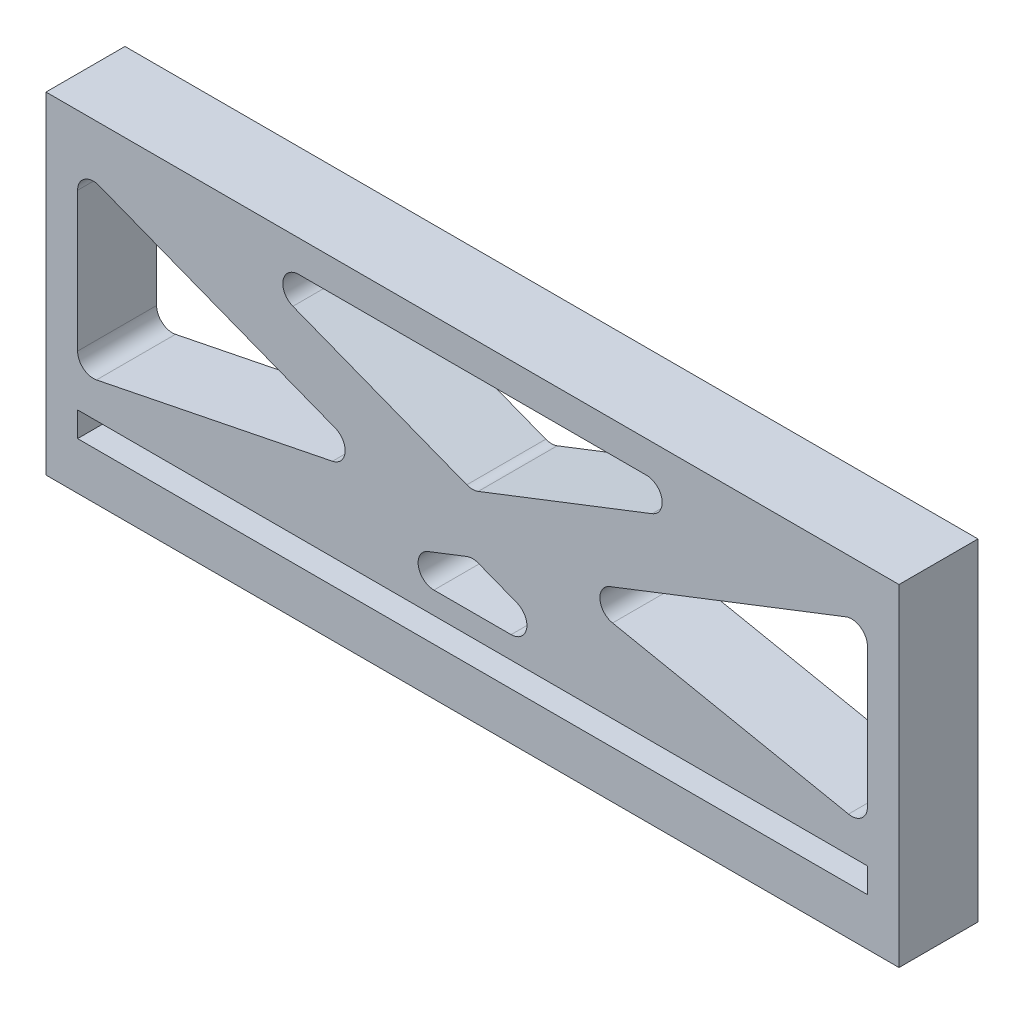
ISO-10303-21;
HEADER;
FILE_DESCRIPTION(('STEP AP214'),'2;1');
FILE_NAME('part.step','',(''),(''),'','','');
FILE_SCHEMA(('AUTOMOTIVE_DESIGN { 1 0 10303 214 1 1 1 1 }'));
ENDSEC;
DATA;
#1=APPLICATION_CONTEXT('core data for automotive mechanical design processes');
#2=APPLICATION_PROTOCOL_DEFINITION('international standard','automotive_design',2000,#1);
#3=PRODUCT_CONTEXT('',#1,'mechanical');
#4=PRODUCT('Part','Part','',(#3));
#5=PRODUCT_RELATED_PRODUCT_CATEGORY('part','',(#4));
#6=PRODUCT_DEFINITION_FORMATION('','',#4);
#7=PRODUCT_DEFINITION_CONTEXT('part definition',#1,'design');
#8=PRODUCT_DEFINITION('design','',#6,#7);
#9=PRODUCT_DEFINITION_SHAPE('','',#8);
#10=(LENGTH_UNIT() NAMED_UNIT(*) SI_UNIT(.MILLI.,.METRE.));
#11=(NAMED_UNIT(*) PLANE_ANGLE_UNIT() SI_UNIT($,.RADIAN.));
#12=(NAMED_UNIT(*) SI_UNIT($,.STERADIAN.) SOLID_ANGLE_UNIT());
#13=UNCERTAINTY_MEASURE_WITH_UNIT(LENGTH_MEASURE(1.E-05),#10,'distance_accuracy_value','');
#14=(GEOMETRIC_REPRESENTATION_CONTEXT(3) GLOBAL_UNCERTAINTY_ASSIGNED_CONTEXT((#13)) GLOBAL_UNIT_ASSIGNED_CONTEXT((#10,
#11,#12)) REPRESENTATION_CONTEXT('',''));
#15=CARTESIAN_POINT('',(0.,0.,0.));
#16=DIRECTION('',(0.,0.,1.));
#17=DIRECTION('',(1.,0.,0.));
#18=AXIS2_PLACEMENT_3D('',#15,#16,#17);
#19=CARTESIAN_POINT('',(0.,0.,6.35));
#20=DIRECTION('',(0.,0.,-1.));
#21=DIRECTION('',(-1.,0.,0.));
#22=AXIS2_PLACEMENT_3D('',#19,#20,#21);
#23=PLANE('',#22);
#24=DIRECTION('',(0.980300913785245,-0.197509793255458,0.));
#25=VECTOR('',#24,1.);
#26=CARTESIAN_POINT('',(31.75,-4.985,6.35));
#27=LINE('',#26,#25);
#28=CARTESIAN_POINT('',(11.2596732728427,-0.856634782027542,6.35));
#29=VERTEX_POINT('',#28);
#30=CARTESIAN_POINT('',(30.2291625625656,-4.67858358885643,6.35));
#31=VERTEX_POINT('',#30);
#32=EDGE_CURVE('E532',#29,#31,#27,.T.);
#33=ORIENTED_EDGE('',*,*,#32,.F.);
#34=CARTESIAN_POINT('',(11.5105107102771,0.388347378479719,6.35));
#35=DIRECTION('',(0.,0.,-1.));
#36=DIRECTION('',(-1.,0.,0.));
#37=AXIS2_PLACEMENT_3D('',#34,#35,#36);
#38=CIRCLE('',#37,1.27);
#39=CARTESIAN_POINT('',(11.0502039586103,1.57199331133717,6.35));
#40=VERTEX_POINT('',#39);
#41=EDGE_CURVE('E445',#29,#40,#38,.T.);
#42=ORIENTED_EDGE('',*,*,#41,.T.);
#43=DIRECTION('',(-0.932004671541298,-0.362446261154944,0.));
#44=VECTOR('',#43,1.);
#45=CARTESIAN_POINT('',(7.00793544374329,0.,6.35));
#46=LINE('',#45,#44);
#47=CARTESIAN_POINT('',(30.0196932483333,8.94901692400708,6.35));
#48=VERTEX_POINT('',#47);
#49=EDGE_CURVE('E541',#48,#40,#46,.T.);
#50=ORIENTED_EDGE('',*,*,#49,.F.);
#51=CARTESIAN_POINT('',(30.48,7.76537099114963,6.35));
#52=DIRECTION('',(0.,0.,-1.));
#53=DIRECTION('',(-1.,0.,0.));
#54=AXIS2_PLACEMENT_3D('',#51,#52,#53);
#55=CIRCLE('',#54,1.27);
#56=CARTESIAN_POINT('',(31.75,7.76537099114963,6.35));
#57=VERTEX_POINT('',#56);
#58=EDGE_CURVE('E433',#48,#57,#55,.T.);
#59=ORIENTED_EDGE('',*,*,#58,.T.);
#60=DIRECTION('',(0.,1.,0.));
#61=VECTOR('',#60,1.);
#62=CARTESIAN_POINT('',(31.75,9.62191399409971,6.35));
#63=LINE('',#62,#61);
#64=CARTESIAN_POINT('',(31.75,-3.43360142834917,6.35));
#65=VERTEX_POINT('',#64);
#66=EDGE_CURVE('E536',#65,#57,#63,.T.);
#67=ORIENTED_EDGE('',*,*,#66,.F.);
#68=CARTESIAN_POINT('',(30.48,-3.43360142834917,6.35));
#69=DIRECTION('',(0.,0.,-1.));
#70=DIRECTION('',(-1.,0.,0.));
#71=AXIS2_PLACEMENT_3D('',#68,#69,#70);
#72=CIRCLE('',#71,1.27);
#73=EDGE_CURVE('E439',#65,#31,#72,.T.);
#74=ORIENTED_EDGE('',*,*,#73,.T.);
#75=EDGE_LOOP('',(#33,#42,#50,#59,#67,#74));
#76=FACE_BOUND('',#75,.T.);
#77=DIRECTION('',(-1.,0.,0.));
#78=VECTOR('',#77,1.);
#79=CARTESIAN_POINT('',(20.7506359848282,10.795,6.35));
#80=LINE('',#79,#78);
#81=CARTESIAN_POINT('',(13.9809539772422,10.795,6.35));
#82=VERTEX_POINT('',#81);
#83=CARTESIAN_POINT('',(-13.9809539772422,10.795,6.35));
#84=VERTEX_POINT('',#83);
#85=EDGE_CURVE('E580',#82,#84,#80,.T.);
#86=ORIENTED_EDGE('',*,*,#85,.F.);
#87=CARTESIAN_POINT('',(13.9809539772422,9.52500000000001,6.35));
#88=DIRECTION('',(0.,0.,-1.));
#89=DIRECTION('',(-1.,0.,0.));
#90=AXIS2_PLACEMENT_3D('',#87,#88,#89);
#91=CIRCLE('',#90,1.27);
#92=CARTESIAN_POINT('',(14.441260728909,8.34135406714256,6.35));
#93=VERTEX_POINT('',#92);
#94=EDGE_CURVE('E451',#82,#93,#91,.T.);
#95=ORIENTED_EDGE('',*,*,#94,.T.);
#96=DIRECTION('',(0.932004671541296,0.362446261154949,0.));
#97=VECTOR('',#96,1.);
#98=CARTESIAN_POINT('',(0.,2.72530822812238,6.35));
#99=LINE('',#98,#97);
#100=CARTESIAN_POINT('',(0.460306751666785,2.90431640932613,6.35));
#101=VERTEX_POINT('',#100);
#102=EDGE_CURVE('E289',#101,#93,#99,.T.);
#103=ORIENTED_EDGE('',*,*,#102,.F.);
#104=CARTESIAN_POINT('',(0.,4.08796234218358,6.35));
#105=DIRECTION('',(0.,0.,-1.));
#106=DIRECTION('',(-1.,0.,0.));
#107=AXIS2_PLACEMENT_3D('',#104,#105,#106);
#108=CIRCLE('',#107,1.27);
#109=CARTESIAN_POINT('',(-0.460306751666785,2.90431640932613,6.35));
#110=VERTEX_POINT('',#109);
#111=EDGE_CURVE('E463',#101,#110,#108,.T.);
#112=ORIENTED_EDGE('',*,*,#111,.T.);
#113=DIRECTION('',(0.932004671541296,-0.362446261154949,0.));
#114=VECTOR('',#113,1.);
#115=CARTESIAN_POINT('',(-20.7506359848282,10.795,6.35));
#116=LINE('',#115,#114);
#117=CARTESIAN_POINT('',(-14.441260728909,8.34135406714256,6.35));
#118=VERTEX_POINT('',#117);
#119=EDGE_CURVE('E584',#118,#110,#116,.T.);
#120=ORIENTED_EDGE('',*,*,#119,.F.);
#121=CARTESIAN_POINT('',(-13.9809539772422,9.52500000000001,6.35));
#122=DIRECTION('',(0.,0.,-1.));
#123=DIRECTION('',(-1.,0.,0.));
#124=AXIS2_PLACEMENT_3D('',#121,#122,#123);
#125=CIRCLE('',#124,1.27);
#126=EDGE_CURVE('E457',#118,#84,#125,.T.);
#127=ORIENTED_EDGE('',*,*,#126,.T.);
#128=EDGE_LOOP('',(#86,#95,#103,#112,#120,#127));
#129=FACE_BOUND('',#128,.T.);
#130=DIRECTION('',(0.,1.,0.));
#131=VECTOR('',#130,1.);
#132=CARTESIAN_POINT('',(34.29,-13.335,6.35));
#133=LINE('',#132,#131);
#134=CARTESIAN_POINT('',(34.29,-13.335,6.35));
#135=VERTEX_POINT('',#134);
#136=CARTESIAN_POINT('',(34.29,13.335,6.35));
#137=VERTEX_POINT('',#136);
#138=EDGE_CURVE('E306',#135,#137,#133,.T.);
#139=ORIENTED_EDGE('',*,*,#138,.T.);
#140=DIRECTION('',(-1.,0.,0.));
#141=VECTOR('',#140,1.);
#142=CARTESIAN_POINT('',(-34.29,13.335,6.35));
#143=LINE('',#142,#141);
#144=CARTESIAN_POINT('',(-34.29,13.335,6.35));
#145=VERTEX_POINT('',#144);
#146=EDGE_CURVE('E310',#137,#145,#143,.T.);
#147=ORIENTED_EDGE('',*,*,#146,.T.);
#148=DIRECTION('',(0.,-1.,0.));
#149=VECTOR('',#148,1.);
#150=CARTESIAN_POINT('',(-34.29,-13.335,6.35));
#151=LINE('',#150,#149);
#152=CARTESIAN_POINT('',(-34.29,-13.335,6.35));
#153=VERTEX_POINT('',#152);
#154=EDGE_CURVE('E314',#145,#153,#151,.T.);
#155=ORIENTED_EDGE('',*,*,#154,.T.);
#156=DIRECTION('',(1.,0.,0.));
#157=VECTOR('',#156,1.);
#158=CARTESIAN_POINT('',(-34.29,-13.335,6.35));
#159=LINE('',#158,#157);
#160=EDGE_CURVE('E317',#153,#135,#159,.T.);
#161=ORIENTED_EDGE('',*,*,#160,.T.);
#162=EDGE_LOOP('',(#139,#147,#155,#161));
#163=FACE_BOUND('',#162,.T.);
#164=DIRECTION('',(0.,1.,0.));
#165=VECTOR('',#164,1.);
#166=CARTESIAN_POINT('',(31.75,-9.525,6.35));
#167=LINE('',#166,#165);
#168=CARTESIAN_POINT('',(31.75,-9.525,6.35));
#169=VERTEX_POINT('',#168);
#170=CARTESIAN_POINT('',(31.75,-7.525,6.35));
#171=VERTEX_POINT('',#170);
#172=EDGE_CURVE('E250',#169,#171,#167,.T.);
#173=ORIENTED_EDGE('',*,*,#172,.F.);
#174=DIRECTION('',(1.,0.,0.));
#175=VECTOR('',#174,1.);
#176=CARTESIAN_POINT('',(-31.75,-9.525,6.35));
#177=LINE('',#176,#175);
#178=CARTESIAN_POINT('',(-31.75,-9.525,6.35));
#179=VERTEX_POINT('',#178);
#180=EDGE_CURVE('E280',#179,#169,#177,.T.);
#181=ORIENTED_EDGE('',*,*,#180,.F.);
#182=DIRECTION('',(0.,-1.,0.));
#183=VECTOR('',#182,1.);
#184=CARTESIAN_POINT('',(-31.75,-9.525,6.35));
#185=LINE('',#184,#183);
#186=CARTESIAN_POINT('',(-31.75,-7.525,6.35));
#187=VERTEX_POINT('',#186);
#188=EDGE_CURVE('E276',#187,#179,#185,.T.);
#189=ORIENTED_EDGE('',*,*,#188,.F.);
#190=DIRECTION('',(-1.,0.,0.));
#191=VECTOR('',#190,1.);
#192=CARTESIAN_POINT('',(-31.75,-7.525,6.35));
#193=LINE('',#192,#191);
#194=EDGE_CURVE('E261',#171,#187,#193,.T.);
#195=ORIENTED_EDGE('',*,*,#194,.F.);
#196=EDGE_LOOP('',(#173,#181,#189,#195));
#197=FACE_BOUND('',#196,.T.);
#198=DIRECTION('',(-0.932004671541296,0.362446261154948,0.));
#199=VECTOR('',#198,1.);
#200=CARTESIAN_POINT('',(-7.0079354437433,0.,6.35));
#201=LINE('',#200,#199);
#202=CARTESIAN_POINT('',(-11.0502039586103,1.57199331133717,6.35));
#203=VERTEX_POINT('',#202);
#204=CARTESIAN_POINT('',(-30.0196932483332,8.94901692400719,6.35));
#205=VERTEX_POINT('',#204);
#206=EDGE_CURVE('E556',#203,#205,#201,.T.);
#207=ORIENTED_EDGE('',*,*,#206,.F.);
#208=CARTESIAN_POINT('',(-11.5105107102771,0.388347378479725,6.35));
#209=DIRECTION('',(0.,0.,-1.));
#210=DIRECTION('',(-1.,0.,0.));
#211=AXIS2_PLACEMENT_3D('',#208,#209,#210);
#212=CIRCLE('',#211,1.27);
#213=CARTESIAN_POINT('',(-11.2596732728427,-0.856634782027537,6.35));
#214=VERTEX_POINT('',#213);
#215=EDGE_CURVE('E469',#203,#214,#212,.T.);
#216=ORIENTED_EDGE('',*,*,#215,.T.);
#217=DIRECTION('',(0.980300913785245,0.197509793255458,0.));
#218=VECTOR('',#217,1.);
#219=CARTESIAN_POINT('',(-31.75,-4.985,6.35));
#220=LINE('',#219,#218);
#221=CARTESIAN_POINT('',(-30.2291625625656,-4.67858358885643,6.35));
#222=VERTEX_POINT('',#221);
#223=EDGE_CURVE('E565',#222,#214,#220,.T.);
#224=ORIENTED_EDGE('',*,*,#223,.F.);
#225=CARTESIAN_POINT('',(-30.48,-3.43360142834917,6.35));
#226=DIRECTION('',(0.,0.,-1.));
#227=DIRECTION('',(-1.,0.,0.));
#228=AXIS2_PLACEMENT_3D('',#225,#226,#227);
#229=CIRCLE('',#228,1.27);
#230=CARTESIAN_POINT('',(-31.75,-3.43360142834917,6.35));
#231=VERTEX_POINT('',#230);
#232=EDGE_CURVE('E481',#222,#231,#229,.T.);
#233=ORIENTED_EDGE('',*,*,#232,.T.);
#234=DIRECTION('',(0.,-1.,0.));
#235=VECTOR('',#234,1.);
#236=CARTESIAN_POINT('',(-31.75,9.62191399409983,6.35));
#237=LINE('',#236,#235);
#238=CARTESIAN_POINT('',(-31.75,7.76537099114975,6.35));
#239=VERTEX_POINT('',#238);
#240=EDGE_CURVE('E560',#239,#231,#237,.T.);
#241=ORIENTED_EDGE('',*,*,#240,.F.);
#242=CARTESIAN_POINT('',(-30.48,7.76537099114975,6.35));
#243=DIRECTION('',(0.,0.,-1.));
#244=DIRECTION('',(-1.,0.,0.));
#245=AXIS2_PLACEMENT_3D('',#242,#243,#244);
#246=CIRCLE('',#245,1.27);
#247=EDGE_CURVE('E475',#239,#205,#246,.T.);
#248=ORIENTED_EDGE('',*,*,#247,.T.);
#249=EDGE_LOOP('',(#207,#216,#224,#233,#241,#248));
#250=FACE_BOUND('',#249,.T.);
#251=DIRECTION('',(-0.932004671541296,0.362446261154949,0.));
#252=VECTOR('',#251,1.);
#253=CARTESIAN_POINT('',(9.8724451893797,-5.747,6.35));
#254=LINE('',#253,#252);
#255=CARTESIAN_POINT('',(3.56306993346055,-3.29335406714255,6.35));
#256=VERTEX_POINT('',#255);
#257=CARTESIAN_POINT('',(0.460306751666783,-2.08672394088942,6.35));
#258=VERTEX_POINT('',#257);
#259=EDGE_CURVE('E511',#256,#258,#254,.T.);
#260=ORIENTED_EDGE('',*,*,#259,.F.);
#261=CARTESIAN_POINT('',(3.10276318179377,-4.477,6.35));
#262=DIRECTION('',(0.,0.,-1.));
#263=DIRECTION('',(-1.,0.,0.));
#264=AXIS2_PLACEMENT_3D('',#261,#262,#263);
#265=CIRCLE('',#264,1.27);
#266=CARTESIAN_POINT('',(3.10276318179377,-5.747,6.35));
#267=VERTEX_POINT('',#266);
#268=EDGE_CURVE('E487',#256,#267,#265,.T.);
#269=ORIENTED_EDGE('',*,*,#268,.T.);
#270=DIRECTION('',(1.,0.,0.));
#271=VECTOR('',#270,1.);
#272=CARTESIAN_POINT('',(-9.8724451893797,-5.747,6.35));
#273=LINE('',#272,#271);
#274=CARTESIAN_POINT('',(-3.10276318179377,-5.747,6.35));
#275=VERTEX_POINT('',#274);
#276=EDGE_CURVE('E517',#275,#267,#273,.T.);
#277=ORIENTED_EDGE('',*,*,#276,.F.);
#278=CARTESIAN_POINT('',(-3.10276318179377,-4.477,6.35));
#279=DIRECTION('',(0.,0.,-1.));
#280=DIRECTION('',(-1.,0.,0.));
#281=AXIS2_PLACEMENT_3D('',#278,#279,#280);
#282=CIRCLE('',#281,1.27);
#283=CARTESIAN_POINT('',(-3.56306993346056,-3.29335406714255,6.35));
#284=VERTEX_POINT('',#283);
#285=EDGE_CURVE('E11',#275,#284,#282,.T.);
#286=ORIENTED_EDGE('',*,*,#285,.T.);
#287=DIRECTION('',(-0.932004671541296,-0.362446261154949,0.));
#288=VECTOR('',#287,1.);
#289=CARTESIAN_POINT('',(0.,-1.90771575968567,6.35));
#290=LINE('',#289,#288);
#291=CARTESIAN_POINT('',(-0.460306751666785,-2.08672394088942,6.35));
#292=VERTEX_POINT('',#291);
#293=EDGE_CURVE('E514',#292,#284,#290,.T.);
#294=ORIENTED_EDGE('',*,*,#293,.F.);
#295=CARTESIAN_POINT('',(0.,-3.27036987374687,6.35));
#296=DIRECTION('',(0.,0.,-1.));
#297=DIRECTION('',(-1.,0.,0.));
#298=AXIS2_PLACEMENT_3D('',#295,#296,#297);
#299=CIRCLE('',#298,1.27);
#300=EDGE_CURVE('E493',#292,#258,#299,.T.);
#301=ORIENTED_EDGE('',*,*,#300,.T.);
#302=EDGE_LOOP('',(#260,#269,#277,#286,#294,#301));
#303=FACE_BOUND('',#302,.T.);
#304=ADVANCED_FACE('F39',(#76,#129,#163,#197,#250,#303),#23,.F.);
#305=CARTESIAN_POINT('',(0.,0.,0.));
#306=DIRECTION('',(0.,0.,-1.));
#307=DIRECTION('',(-1.,0.,0.));
#308=AXIS2_PLACEMENT_3D('',#305,#306,#307);
#309=PLANE('',#308);
#310=DIRECTION('',(0.,1.,0.));
#311=VECTOR('',#310,1.);
#312=CARTESIAN_POINT('',(34.29,-13.335,0.));
#313=LINE('',#312,#311);
#314=CARTESIAN_POINT('',(34.29,-13.335,0.));
#315=VERTEX_POINT('',#314);
#316=CARTESIAN_POINT('',(34.29,13.335,0.));
#317=VERTEX_POINT('',#316);
#318=EDGE_CURVE('E270',#315,#317,#313,.T.);
#319=ORIENTED_EDGE('',*,*,#318,.F.);
#320=DIRECTION('',(1.,0.,0.));
#321=VECTOR('',#320,1.);
#322=CARTESIAN_POINT('',(-34.29,-13.335,0.));
#323=LINE('',#322,#321);
#324=CARTESIAN_POINT('',(-34.29,-13.335,0.));
#325=VERTEX_POINT('',#324);
#326=EDGE_CURVE('E311',#325,#315,#323,.T.);
#327=ORIENTED_EDGE('',*,*,#326,.F.);
#328=DIRECTION('',(0.,-1.,0.));
#329=VECTOR('',#328,1.);
#330=CARTESIAN_POINT('',(-34.29,-13.335,0.));
#331=LINE('',#330,#329);
#332=CARTESIAN_POINT('',(-34.29,13.335,0.));
#333=VERTEX_POINT('',#332);
#334=EDGE_CURVE('E327',#333,#325,#331,.T.);
#335=ORIENTED_EDGE('',*,*,#334,.F.);
#336=DIRECTION('',(-1.,0.,0.));
#337=VECTOR('',#336,1.);
#338=CARTESIAN_POINT('',(-34.29,13.335,0.));
#339=LINE('',#338,#337);
#340=EDGE_CURVE('E324',#317,#333,#339,.T.);
#341=ORIENTED_EDGE('',*,*,#340,.F.);
#342=EDGE_LOOP('',(#319,#327,#335,#341));
#343=FACE_BOUND('',#342,.T.);
#344=DIRECTION('',(1.,0.,0.));
#345=VECTOR('',#344,1.);
#346=CARTESIAN_POINT('',(-31.75,-9.525,0.));
#347=LINE('',#346,#345);
#348=CARTESIAN_POINT('',(-31.75,-9.525,0.));
#349=VERTEX_POINT('',#348);
#350=CARTESIAN_POINT('',(31.75,-9.525,0.));
#351=VERTEX_POINT('',#350);
#352=EDGE_CURVE('E262',#349,#351,#347,.T.);
#353=ORIENTED_EDGE('',*,*,#352,.T.);
#354=DIRECTION('',(0.,1.,0.));
#355=VECTOR('',#354,1.);
#356=CARTESIAN_POINT('',(31.75,-9.525,0.));
#357=LINE('',#356,#355);
#358=CARTESIAN_POINT('',(31.75,-7.525,0.));
#359=VERTEX_POINT('',#358);
#360=EDGE_CURVE('E286',#351,#359,#357,.T.);
#361=ORIENTED_EDGE('',*,*,#360,.T.);
#362=DIRECTION('',(-1.,0.,0.));
#363=VECTOR('',#362,1.);
#364=CARTESIAN_POINT('',(-31.75,-7.525,0.));
#365=LINE('',#364,#363);
#366=CARTESIAN_POINT('',(-31.75,-7.525,0.));
#367=VERTEX_POINT('',#366);
#368=EDGE_CURVE('E268',#359,#367,#365,.T.);
#369=ORIENTED_EDGE('',*,*,#368,.T.);
#370=DIRECTION('',(0.,-1.,0.));
#371=VECTOR('',#370,1.);
#372=CARTESIAN_POINT('',(-31.75,-9.525,0.));
#373=LINE('',#372,#371);
#374=EDGE_CURVE('E292',#367,#349,#373,.T.);
#375=ORIENTED_EDGE('',*,*,#374,.T.);
#376=EDGE_LOOP('',(#353,#361,#369,#375));
#377=FACE_BOUND('',#376,.T.);
#378=DIRECTION('',(0.932004671541296,-0.362446261154949,0.));
#379=VECTOR('',#378,1.);
#380=CARTESIAN_POINT('',(-20.7506359848282,10.795,0.));
#381=LINE('',#380,#379);
#382=CARTESIAN_POINT('',(-14.441260728909,8.34135406714256,0.));
#383=VERTEX_POINT('',#382);
#384=CARTESIAN_POINT('',(-0.460306751666785,2.90431640932613,0.));
#385=VERTEX_POINT('',#384);
#386=EDGE_CURVE('E595',#383,#385,#381,.T.);
#387=ORIENTED_EDGE('',*,*,#386,.T.);
#388=CARTESIAN_POINT('',(0.,4.08796234218358,0.));
#389=DIRECTION('',(0.,0.,-1.));
#390=DIRECTION('',(-1.,0.,0.));
#391=AXIS2_PLACEMENT_3D('',#388,#389,#390);
#392=CIRCLE('',#391,1.27);
#393=CARTESIAN_POINT('',(0.460306751666785,2.90431640932613,0.));
#394=VERTEX_POINT('',#393);
#395=EDGE_CURVE('E460',#385,#394,#392,.F.);
#396=ORIENTED_EDGE('',*,*,#395,.T.);
#397=DIRECTION('',(0.932004671541296,0.362446261154949,0.));
#398=VECTOR('',#397,1.);
#399=CARTESIAN_POINT('',(0.,2.72530822812238,0.));
#400=LINE('',#399,#398);
#401=CARTESIAN_POINT('',(14.441260728909,8.34135406714256,0.));
#402=VERTEX_POINT('',#401);
#403=EDGE_CURVE('E585',#394,#402,#400,.T.);
#404=ORIENTED_EDGE('',*,*,#403,.T.);
#405=CARTESIAN_POINT('',(13.9809539772422,9.52500000000001,0.));
#406=DIRECTION('',(0.,0.,-1.));
#407=DIRECTION('',(-1.,0.,0.));
#408=AXIS2_PLACEMENT_3D('',#405,#406,#407);
#409=CIRCLE('',#408,1.27);
#410=CARTESIAN_POINT('',(13.9809539772422,10.795,0.));
#411=VERTEX_POINT('',#410);
#412=EDGE_CURVE('E448',#402,#411,#409,.F.);
#413=ORIENTED_EDGE('',*,*,#412,.T.);
#414=DIRECTION('',(-1.,0.,0.));
#415=VECTOR('',#414,1.);
#416=CARTESIAN_POINT('',(20.7506359848282,10.795,0.));
#417=LINE('',#416,#415);
#418=CARTESIAN_POINT('',(-13.9809539772422,10.795,0.));
#419=VERTEX_POINT('',#418);
#420=EDGE_CURVE('E569',#411,#419,#417,.T.);
#421=ORIENTED_EDGE('',*,*,#420,.T.);
#422=CARTESIAN_POINT('',(-13.9809539772422,9.52500000000001,0.));
#423=DIRECTION('',(0.,0.,-1.));
#424=DIRECTION('',(-1.,0.,0.));
#425=AXIS2_PLACEMENT_3D('',#422,#423,#424);
#426=CIRCLE('',#425,1.27);
#427=EDGE_CURVE('E454',#419,#383,#426,.F.);
#428=ORIENTED_EDGE('',*,*,#427,.T.);
#429=EDGE_LOOP('',(#387,#396,#404,#413,#421,#428));
#430=FACE_BOUND('',#429,.T.);
#431=DIRECTION('',(0.,-1.,0.));
#432=VECTOR('',#431,1.);
#433=CARTESIAN_POINT('',(-31.75,9.62191399409983,0.));
#434=LINE('',#433,#432);
#435=CARTESIAN_POINT('',(-31.75,7.76537099114975,0.));
#436=VERTEX_POINT('',#435);
#437=CARTESIAN_POINT('',(-31.75,-3.43360142834917,0.));
#438=VERTEX_POINT('',#437);
#439=EDGE_CURVE('E573',#436,#438,#434,.T.);
#440=ORIENTED_EDGE('',*,*,#439,.T.);
#441=CARTESIAN_POINT('',(-30.48,-3.43360142834917,0.));
#442=DIRECTION('',(0.,0.,-1.));
#443=DIRECTION('',(-1.,0.,0.));
#444=AXIS2_PLACEMENT_3D('',#441,#442,#443);
#445=CIRCLE('',#444,1.27);
#446=CARTESIAN_POINT('',(-30.2291625625656,-4.67858358885643,0.));
#447=VERTEX_POINT('',#446);
#448=EDGE_CURVE('E478',#438,#447,#445,.F.);
#449=ORIENTED_EDGE('',*,*,#448,.T.);
#450=DIRECTION('',(0.980300913785245,0.197509793255458,0.));
#451=VECTOR('',#450,1.);
#452=CARTESIAN_POINT('',(-31.75,-4.985,0.));
#453=LINE('',#452,#451);
#454=CARTESIAN_POINT('',(-11.2596732728427,-0.856634782027537,0.));
#455=VERTEX_POINT('',#454);
#456=EDGE_CURVE('E561',#447,#455,#453,.T.);
#457=ORIENTED_EDGE('',*,*,#456,.T.);
#458=CARTESIAN_POINT('',(-11.5105107102771,0.388347378479725,0.));
#459=DIRECTION('',(0.,0.,-1.));
#460=DIRECTION('',(-1.,0.,0.));
#461=AXIS2_PLACEMENT_3D('',#458,#459,#460);
#462=CIRCLE('',#461,1.27);
#463=CARTESIAN_POINT('',(-11.0502039586103,1.57199331133717,0.));
#464=VERTEX_POINT('',#463);
#465=EDGE_CURVE('E466',#455,#464,#462,.F.);
#466=ORIENTED_EDGE('',*,*,#465,.T.);
#467=DIRECTION('',(-0.932004671541296,0.362446261154948,0.));
#468=VECTOR('',#467,1.);
#469=CARTESIAN_POINT('',(-7.0079354437433,0.,0.));
#470=LINE('',#469,#468);
#471=CARTESIAN_POINT('',(-30.0196932483332,8.94901692400719,0.));
#472=VERTEX_POINT('',#471);
#473=EDGE_CURVE('E545',#464,#472,#470,.T.);
#474=ORIENTED_EDGE('',*,*,#473,.T.);
#475=CARTESIAN_POINT('',(-30.48,7.76537099114975,0.));
#476=DIRECTION('',(0.,0.,-1.));
#477=DIRECTION('',(-1.,0.,0.));
#478=AXIS2_PLACEMENT_3D('',#475,#476,#477);
#479=CIRCLE('',#478,1.27);
#480=EDGE_CURVE('E472',#472,#436,#479,.F.);
#481=ORIENTED_EDGE('',*,*,#480,.T.);
#482=EDGE_LOOP('',(#440,#449,#457,#466,#474,#481));
#483=FACE_BOUND('',#482,.T.);
#484=DIRECTION('',(0.,1.,0.));
#485=VECTOR('',#484,1.);
#486=CARTESIAN_POINT('',(31.75,9.62191399409971,0.));
#487=LINE('',#486,#485);
#488=CARTESIAN_POINT('',(31.75,-3.43360142834917,0.));
#489=VERTEX_POINT('',#488);
#490=CARTESIAN_POINT('',(31.75,7.76537099114963,0.));
#491=VERTEX_POINT('',#490);
#492=EDGE_CURVE('E549',#489,#491,#487,.T.);
#493=ORIENTED_EDGE('',*,*,#492,.T.);
#494=CARTESIAN_POINT('',(30.48,7.76537099114963,0.));
#495=DIRECTION('',(0.,0.,-1.));
#496=DIRECTION('',(-1.,0.,0.));
#497=AXIS2_PLACEMENT_3D('',#494,#495,#496);
#498=CIRCLE('',#497,1.27);
#499=CARTESIAN_POINT('',(30.0196932483333,8.94901692400708,0.));
#500=VERTEX_POINT('',#499);
#501=EDGE_CURVE('E430',#491,#500,#498,.F.);
#502=ORIENTED_EDGE('',*,*,#501,.T.);
#503=DIRECTION('',(-0.932004671541298,-0.362446261154944,0.));
#504=VECTOR('',#503,1.);
#505=CARTESIAN_POINT('',(7.00793544374329,0.,0.));
#506=LINE('',#505,#504);
#507=CARTESIAN_POINT('',(11.0502039586103,1.57199331133717,0.));
#508=VERTEX_POINT('',#507);
#509=EDGE_CURVE('E537',#500,#508,#506,.T.);
#510=ORIENTED_EDGE('',*,*,#509,.T.);
#511=CARTESIAN_POINT('',(11.5105107102771,0.388347378479719,0.));
#512=DIRECTION('',(0.,0.,-1.));
#513=DIRECTION('',(-1.,0.,0.));
#514=AXIS2_PLACEMENT_3D('',#511,#512,#513);
#515=CIRCLE('',#514,1.27);
#516=CARTESIAN_POINT('',(11.2596732728427,-0.856634782027542,0.));
#517=VERTEX_POINT('',#516);
#518=EDGE_CURVE('E442',#508,#517,#515,.F.);
#519=ORIENTED_EDGE('',*,*,#518,.T.);
#520=DIRECTION('',(0.980300913785245,-0.197509793255458,0.));
#521=VECTOR('',#520,1.);
#522=CARTESIAN_POINT('',(31.75,-4.985,0.));
#523=LINE('',#522,#521);
#524=CARTESIAN_POINT('',(30.2291625625656,-4.67858358885643,0.));
#525=VERTEX_POINT('',#524);
#526=EDGE_CURVE('E521',#517,#525,#523,.T.);
#527=ORIENTED_EDGE('',*,*,#526,.T.);
#528=CARTESIAN_POINT('',(30.48,-3.43360142834917,0.));
#529=DIRECTION('',(0.,0.,-1.));
#530=DIRECTION('',(-1.,0.,0.));
#531=AXIS2_PLACEMENT_3D('',#528,#529,#530);
#532=CIRCLE('',#531,1.27);
#533=EDGE_CURVE('E436',#525,#489,#532,.F.);
#534=ORIENTED_EDGE('',*,*,#533,.T.);
#535=EDGE_LOOP('',(#493,#502,#510,#519,#527,#534));
#536=FACE_BOUND('',#535,.T.);
#537=DIRECTION('',(-0.932004671541296,-0.362446261154949,0.));
#538=VECTOR('',#537,1.);
#539=CARTESIAN_POINT('',(0.,-1.90771575968567,0.));
#540=LINE('',#539,#538);
#541=CARTESIAN_POINT('',(-0.460306751666785,-2.08672394088942,0.));
#542=VERTEX_POINT('',#541);
#543=CARTESIAN_POINT('',(-3.56306993346056,-3.29335406714255,0.));
#544=VERTEX_POINT('',#543);
#545=EDGE_CURVE('E502',#542,#544,#540,.T.);
#546=ORIENTED_EDGE('',*,*,#545,.T.);
#547=CARTESIAN_POINT('',(-3.10276318179377,-4.477,0.));
#548=DIRECTION('',(0.,0.,-1.));
#549=DIRECTION('',(-1.,0.,0.));
#550=AXIS2_PLACEMENT_3D('',#547,#548,#549);
#551=CIRCLE('',#550,1.27);
#552=CARTESIAN_POINT('',(-3.10276318179377,-5.747,0.));
#553=VERTEX_POINT('',#552);
#554=EDGE_CURVE('E48',#544,#553,#551,.F.);
#555=ORIENTED_EDGE('',*,*,#554,.T.);
#556=DIRECTION('',(1.,0.,0.));
#557=VECTOR('',#556,1.);
#558=CARTESIAN_POINT('',(-9.8724451893797,-5.747,0.));
#559=LINE('',#558,#557);
#560=CARTESIAN_POINT('',(3.10276318179377,-5.747,0.));
#561=VERTEX_POINT('',#560);
#562=EDGE_CURVE('E501',#553,#561,#559,.T.);
#563=ORIENTED_EDGE('',*,*,#562,.T.);
#564=CARTESIAN_POINT('',(3.10276318179377,-4.477,0.));
#565=DIRECTION('',(0.,0.,-1.));
#566=DIRECTION('',(-1.,0.,0.));
#567=AXIS2_PLACEMENT_3D('',#564,#565,#566);
#568=CIRCLE('',#567,1.27);
#569=CARTESIAN_POINT('',(3.56306993346055,-3.29335406714255,0.));
#570=VERTEX_POINT('',#569);
#571=EDGE_CURVE('E484',#561,#570,#568,.F.);
#572=ORIENTED_EDGE('',*,*,#571,.T.);
#573=DIRECTION('',(-0.932004671541296,0.362446261154949,0.));
#574=VECTOR('',#573,1.);
#575=CARTESIAN_POINT('',(9.8724451893797,-5.747,0.));
#576=LINE('',#575,#574);
#577=CARTESIAN_POINT('',(0.460306751666783,-2.08672394088942,0.));
#578=VERTEX_POINT('',#577);
#579=EDGE_CURVE('E526',#570,#578,#576,.T.);
#580=ORIENTED_EDGE('',*,*,#579,.T.);
#581=CARTESIAN_POINT('',(0.,-3.27036987374687,0.));
#582=DIRECTION('',(0.,0.,-1.));
#583=DIRECTION('',(-1.,0.,0.));
#584=AXIS2_PLACEMENT_3D('',#581,#582,#583);
#585=CIRCLE('',#584,1.27);
#586=EDGE_CURVE('E490',#578,#542,#585,.F.);
#587=ORIENTED_EDGE('',*,*,#586,.T.);
#588=EDGE_LOOP('',(#546,#555,#563,#572,#580,#587));
#589=FACE_BOUND('',#588,.T.);
#590=ADVANCED_FACE('F500',(#343,#377,#430,#483,#536,#589),#309,.T.);
#591=CARTESIAN_POINT('',(34.29,-13.335,6.35));
#592=DIRECTION('',(-1.,0.,0.));
#593=DIRECTION('',(0.,0.,1.));
#594=AXIS2_PLACEMENT_3D('',#591,#592,#593);
#595=PLANE('',#594);
#596=ORIENTED_EDGE('',*,*,#318,.T.);
#597=DIRECTION('',(0.,0.,-1.));
#598=VECTOR('',#597,1.);
#599=CARTESIAN_POINT('',(34.29,13.335,6.35));
#600=LINE('',#599,#598);
#601=EDGE_CURVE('E343',#137,#317,#600,.T.);
#602=ORIENTED_EDGE('',*,*,#601,.F.);
#603=ORIENTED_EDGE('',*,*,#138,.F.);
#604=DIRECTION('',(0.,0.,-1.));
#605=VECTOR('',#604,1.);
#606=CARTESIAN_POINT('',(34.29,-13.335,6.35));
#607=LINE('',#606,#605);
#608=EDGE_CURVE('E320',#135,#315,#607,.T.);
#609=ORIENTED_EDGE('',*,*,#608,.T.);
#610=EDGE_LOOP('',(#596,#602,#603,#609));
#611=FACE_BOUND('',#610,.T.);
#612=ADVANCED_FACE('F648',(#611),#595,.F.);
#613=CARTESIAN_POINT('',(-34.29,13.335,6.35));
#614=DIRECTION('',(0.,-1.,0.));
#615=DIRECTION('',(0.,0.,-1.));
#616=AXIS2_PLACEMENT_3D('',#613,#614,#615);
#617=PLANE('',#616);
#618=ORIENTED_EDGE('',*,*,#340,.T.);
#619=DIRECTION('',(0.,0.,-1.));
#620=VECTOR('',#619,1.);
#621=CARTESIAN_POINT('',(-34.29,13.335,6.35));
#622=LINE('',#621,#620);
#623=EDGE_CURVE('E339',#145,#333,#622,.T.);
#624=ORIENTED_EDGE('',*,*,#623,.F.);
#625=ORIENTED_EDGE('',*,*,#146,.F.);
#626=ORIENTED_EDGE('',*,*,#601,.T.);
#627=EDGE_LOOP('',(#618,#624,#625,#626));
#628=FACE_BOUND('',#627,.T.);
#629=ADVANCED_FACE('F662',(#628),#617,.F.);
#630=CARTESIAN_POINT('',(-34.29,-13.335,6.35));
#631=DIRECTION('',(1.,0.,0.));
#632=DIRECTION('',(0.,0.,-1.));
#633=AXIS2_PLACEMENT_3D('',#630,#631,#632);
#634=PLANE('',#633);
#635=ORIENTED_EDGE('',*,*,#334,.T.);
#636=DIRECTION('',(0.,0.,-1.));
#637=VECTOR('',#636,1.);
#638=CARTESIAN_POINT('',(-34.29,-13.335,6.35));
#639=LINE('',#638,#637);
#640=EDGE_CURVE('E335',#153,#325,#639,.T.);
#641=ORIENTED_EDGE('',*,*,#640,.F.);
#642=ORIENTED_EDGE('',*,*,#154,.F.);
#643=ORIENTED_EDGE('',*,*,#623,.T.);
#644=EDGE_LOOP('',(#635,#641,#642,#643));
#645=FACE_BOUND('',#644,.T.);
#646=ADVANCED_FACE('F658',(#645),#634,.F.);
#647=CARTESIAN_POINT('',(-34.29,-13.335,6.35));
#648=DIRECTION('',(0.,1.,0.));
#649=DIRECTION('',(-1.,0.,0.));
#650=AXIS2_PLACEMENT_3D('',#647,#648,#649);
#651=PLANE('',#650);
#652=ORIENTED_EDGE('',*,*,#326,.T.);
#653=ORIENTED_EDGE('',*,*,#608,.F.);
#654=ORIENTED_EDGE('',*,*,#160,.F.);
#655=ORIENTED_EDGE('',*,*,#640,.T.);
#656=EDGE_LOOP('',(#652,#653,#654,#655));
#657=FACE_BOUND('',#656,.T.);
#658=ADVANCED_FACE('F655',(#657),#651,.F.);
#659=CARTESIAN_POINT('',(31.75,-9.525,6.35));
#660=DIRECTION('',(-1.,0.,0.));
#661=DIRECTION('',(0.,-1.,0.));
#662=AXIS2_PLACEMENT_3D('',#659,#660,#661);
#663=PLANE('',#662);
#664=ORIENTED_EDGE('',*,*,#360,.F.);
#665=DIRECTION('',(0.,0.,-1.));
#666=VECTOR('',#665,1.);
#667=CARTESIAN_POINT('',(31.75,-9.525,6.35));
#668=LINE('',#667,#666);
#669=EDGE_CURVE('E256',#169,#351,#668,.T.);
#670=ORIENTED_EDGE('',*,*,#669,.F.);
#671=ORIENTED_EDGE('',*,*,#172,.T.);
#672=DIRECTION('',(0.,0.,-1.));
#673=VECTOR('',#672,1.);
#674=CARTESIAN_POINT('',(31.75,-7.525,6.35));
#675=LINE('',#674,#673);
#676=EDGE_CURVE('E253',#171,#359,#675,.T.);
#677=ORIENTED_EDGE('',*,*,#676,.T.);
#678=EDGE_LOOP('',(#664,#670,#671,#677));
#679=FACE_BOUND('',#678,.T.);
#680=ADVANCED_FACE('F252',(#679),#663,.T.);
#681=CARTESIAN_POINT('',(-31.75,-7.525,6.35));
#682=DIRECTION('',(0.,-1.,0.));
#683=DIRECTION('',(0.,0.,-1.));
#684=AXIS2_PLACEMENT_3D('',#681,#682,#683);
#685=PLANE('',#684);
#686=ORIENTED_EDGE('',*,*,#368,.F.);
#687=ORIENTED_EDGE('',*,*,#676,.F.);
#688=ORIENTED_EDGE('',*,*,#194,.T.);
#689=DIRECTION('',(0.,0.,-1.));
#690=VECTOR('',#689,1.);
#691=CARTESIAN_POINT('',(-31.75,-7.525,6.35));
#692=LINE('',#691,#690);
#693=EDGE_CURVE('E271',#187,#367,#692,.T.);
#694=ORIENTED_EDGE('',*,*,#693,.T.);
#695=EDGE_LOOP('',(#686,#687,#688,#694));
#696=FACE_BOUND('',#695,.T.);
#697=ADVANCED_FACE('F265',(#696),#685,.T.);
#698=CARTESIAN_POINT('',(-31.75,-9.525,6.35));
#699=DIRECTION('',(1.,0.,0.));
#700=DIRECTION('',(0.,1.,0.));
#701=AXIS2_PLACEMENT_3D('',#698,#699,#700);
#702=PLANE('',#701);
#703=ORIENTED_EDGE('',*,*,#374,.F.);
#704=ORIENTED_EDGE('',*,*,#693,.F.);
#705=ORIENTED_EDGE('',*,*,#188,.T.);
#706=DIRECTION('',(0.,0.,-1.));
#707=VECTOR('',#706,1.);
#708=CARTESIAN_POINT('',(-31.75,-9.525,6.35));
#709=LINE('',#708,#707);
#710=EDGE_CURVE('E301',#179,#349,#709,.T.);
#711=ORIENTED_EDGE('',*,*,#710,.T.);
#712=EDGE_LOOP('',(#703,#704,#705,#711));
#713=FACE_BOUND('',#712,.T.);
#714=ADVANCED_FACE('F731',(#713),#702,.T.);
#715=CARTESIAN_POINT('',(-31.75,-9.525,6.35));
#716=DIRECTION('',(0.,1.,0.));
#717=DIRECTION('',(0.,0.,1.));
#718=AXIS2_PLACEMENT_3D('',#715,#716,#717);
#719=PLANE('',#718);
#720=ORIENTED_EDGE('',*,*,#352,.F.);
#721=ORIENTED_EDGE('',*,*,#710,.F.);
#722=ORIENTED_EDGE('',*,*,#180,.T.);
#723=ORIENTED_EDGE('',*,*,#669,.T.);
#724=EDGE_LOOP('',(#720,#721,#722,#723));
#725=FACE_BOUND('',#724,.T.);
#726=ADVANCED_FACE('F728',(#725),#719,.T.);
#727=CARTESIAN_POINT('',(20.7506359848282,10.795,6.35));
#728=DIRECTION('',(0.,-1.,0.));
#729=DIRECTION('',(0.,0.,-1.));
#730=AXIS2_PLACEMENT_3D('',#727,#728,#729);
#731=PLANE('',#730);
#732=ORIENTED_EDGE('',*,*,#420,.F.);
#733=DIRECTION('',(0.,0.,-1.));
#734=VECTOR('',#733,1.);
#735=CARTESIAN_POINT('',(13.9809539772422,10.795,6.35));
#736=LINE('',#735,#734);
#737=EDGE_CURVE('E379',#411,#82,#736,.F.);
#738=ORIENTED_EDGE('',*,*,#737,.T.);
#739=ORIENTED_EDGE('',*,*,#85,.T.);
#740=DIRECTION('',(0.,0.,-1.));
#741=VECTOR('',#740,1.);
#742=CARTESIAN_POINT('',(-13.9809539772422,10.795,0.));
#743=LINE('',#742,#741);
#744=EDGE_CURVE('E375',#84,#419,#743,.T.);
#745=ORIENTED_EDGE('',*,*,#744,.T.);
#746=EDGE_LOOP('',(#732,#738,#739,#745));
#747=FACE_BOUND('',#746,.T.);
#748=ADVANCED_FACE('F627',(#747),#731,.T.);
#749=CARTESIAN_POINT('',(-20.7506359848282,10.795,6.35));
#750=DIRECTION('',(0.362446261154949,0.932004671541296,0.));
#751=DIRECTION('',(-0.932004671541296,0.362446261154949,0.));
#752=AXIS2_PLACEMENT_3D('',#749,#750,#751);
#753=PLANE('',#752);
#754=ORIENTED_EDGE('',*,*,#386,.F.);
#755=DIRECTION('',(0.,0.,-1.));
#756=VECTOR('',#755,1.);
#757=CARTESIAN_POINT('',(-14.441260728909,8.34135406714256,6.35));
#758=LINE('',#757,#756);
#759=EDGE_CURVE('E386',#383,#118,#758,.F.);
#760=ORIENTED_EDGE('',*,*,#759,.T.);
#761=ORIENTED_EDGE('',*,*,#119,.T.);
#762=DIRECTION('',(0.,0.,-1.));
#763=VECTOR('',#762,1.);
#764=CARTESIAN_POINT('',(-0.460306751666785,2.90431640932613,0.));
#765=LINE('',#764,#763);
#766=EDGE_CURVE('E382',#110,#385,#765,.T.);
#767=ORIENTED_EDGE('',*,*,#766,.T.);
#768=EDGE_LOOP('',(#754,#760,#761,#767));
#769=FACE_BOUND('',#768,.T.);
#770=ADVANCED_FACE('F620',(#769),#753,.T.);
#771=CARTESIAN_POINT('',(0.,2.72530822812238,6.35));
#772=DIRECTION('',(-0.362446261154949,0.932004671541296,0.));
#773=DIRECTION('',(-0.932004671541296,-0.362446261154949,0.));
#774=AXIS2_PLACEMENT_3D('',#771,#772,#773);
#775=PLANE('',#774);
#776=ORIENTED_EDGE('',*,*,#102,.T.);
#777=DIRECTION('',(0.,0.,-1.));
#778=VECTOR('',#777,1.);
#779=CARTESIAN_POINT('',(14.441260728909,8.34135406714256,0.));
#780=LINE('',#779,#778);
#781=EDGE_CURVE('E371',#93,#402,#780,.T.);
#782=ORIENTED_EDGE('',*,*,#781,.T.);
#783=ORIENTED_EDGE('',*,*,#403,.F.);
#784=DIRECTION('',(0.,0.,-1.));
#785=VECTOR('',#784,1.);
#786=CARTESIAN_POINT('',(0.460306751666785,2.90431640932613,6.35));
#787=LINE('',#786,#785);
#788=EDGE_CURVE('E368',#394,#101,#787,.F.);
#789=ORIENTED_EDGE('',*,*,#788,.T.);
#790=EDGE_LOOP('',(#776,#782,#783,#789));
#791=FACE_BOUND('',#790,.T.);
#792=ADVANCED_FACE('F606',(#791),#775,.T.);
#793=CARTESIAN_POINT('',(-7.0079354437433,0.,6.35));
#794=DIRECTION('',(-0.362446261154948,-0.932004671541296,0.));
#795=DIRECTION('',(0.932004671541296,-0.362446261154948,0.));
#796=AXIS2_PLACEMENT_3D('',#793,#794,#795);
#797=PLANE('',#796);
#798=ORIENTED_EDGE('',*,*,#473,.F.);
#799=DIRECTION('',(0.,0.,-1.));
#800=VECTOR('',#799,1.);
#801=CARTESIAN_POINT('',(-11.0502039586103,1.57199331133717,6.35));
#802=LINE('',#801,#800);
#803=EDGE_CURVE('E400',#464,#203,#802,.F.);
#804=ORIENTED_EDGE('',*,*,#803,.T.);
#805=ORIENTED_EDGE('',*,*,#206,.T.);
#806=DIRECTION('',(0.,0.,-1.));
#807=VECTOR('',#806,1.);
#808=CARTESIAN_POINT('',(-30.0196932483332,8.94901692400719,0.));
#809=LINE('',#808,#807);
#810=EDGE_CURVE('E396',#205,#472,#809,.T.);
#811=ORIENTED_EDGE('',*,*,#810,.T.);
#812=EDGE_LOOP('',(#798,#804,#805,#811));
#813=FACE_BOUND('',#812,.T.);
#814=ADVANCED_FACE('F717',(#813),#797,.T.);
#815=CARTESIAN_POINT('',(-31.75,9.62191399409983,6.35));
#816=DIRECTION('',(1.,0.,0.));
#817=DIRECTION('',(0.,0.,-1.));
#818=AXIS2_PLACEMENT_3D('',#815,#816,#817);
#819=PLANE('',#818);
#820=ORIENTED_EDGE('',*,*,#439,.F.);
#821=DIRECTION('',(0.,0.,-1.));
#822=VECTOR('',#821,1.);
#823=CARTESIAN_POINT('',(-31.75,7.76537099114975,6.35));
#824=LINE('',#823,#822);
#825=EDGE_CURVE('E407',#436,#239,#824,.F.);
#826=ORIENTED_EDGE('',*,*,#825,.T.);
#827=ORIENTED_EDGE('',*,*,#240,.T.);
#828=DIRECTION('',(0.,0.,-1.));
#829=VECTOR('',#828,1.);
#830=CARTESIAN_POINT('',(-31.75,-3.43360142834917,0.));
#831=LINE('',#830,#829);
#832=EDGE_CURVE('E403',#231,#438,#831,.T.);
#833=ORIENTED_EDGE('',*,*,#832,.T.);
#834=EDGE_LOOP('',(#820,#826,#827,#833));
#835=FACE_BOUND('',#834,.T.);
#836=ADVANCED_FACE('F713',(#835),#819,.T.);
#837=CARTESIAN_POINT('',(-31.75,-4.985,6.35));
#838=DIRECTION('',(-0.197509793255458,0.980300913785245,0.));
#839=DIRECTION('',(-0.980300913785245,-0.197509793255458,0.));
#840=AXIS2_PLACEMENT_3D('',#837,#838,#839);
#841=PLANE('',#840);
#842=ORIENTED_EDGE('',*,*,#223,.T.);
#843=DIRECTION('',(0.,0.,-1.));
#844=VECTOR('',#843,1.);
#845=CARTESIAN_POINT('',(-11.2596732728427,-0.856634782027536,0.));
#846=LINE('',#845,#844);
#847=EDGE_CURVE('E392',#214,#455,#846,.T.);
#848=ORIENTED_EDGE('',*,*,#847,.T.);
#849=ORIENTED_EDGE('',*,*,#456,.F.);
#850=DIRECTION('',(0.,0.,-1.));
#851=VECTOR('',#850,1.);
#852=CARTESIAN_POINT('',(-30.2291625625656,-4.67858358885643,6.35));
#853=LINE('',#852,#851);
#854=EDGE_CURVE('E389',#447,#222,#853,.F.);
#855=ORIENTED_EDGE('',*,*,#854,.T.);
#856=EDGE_LOOP('',(#842,#848,#849,#855));
#857=FACE_BOUND('',#856,.T.);
#858=ADVANCED_FACE('F707',(#857),#841,.T.);
#859=CARTESIAN_POINT('',(31.75,-4.985,6.35));
#860=DIRECTION('',(0.197509793255458,0.980300913785245,0.));
#861=DIRECTION('',(-0.980300913785245,0.197509793255458,0.));
#862=AXIS2_PLACEMENT_3D('',#859,#860,#861);
#863=PLANE('',#862);
#864=ORIENTED_EDGE('',*,*,#32,.T.);
#865=DIRECTION('',(0.,0.,-1.));
#866=VECTOR('',#865,1.);
#867=CARTESIAN_POINT('',(30.2291625625656,-4.67858358885643,0.));
#868=LINE('',#867,#866);
#869=EDGE_CURVE('E364',#31,#525,#868,.T.);
#870=ORIENTED_EDGE('',*,*,#869,.T.);
#871=ORIENTED_EDGE('',*,*,#526,.F.);
#872=DIRECTION('',(0.,0.,-1.));
#873=VECTOR('',#872,1.);
#874=CARTESIAN_POINT('',(11.2596732728427,-0.856634782027542,6.35));
#875=LINE('',#874,#873);
#876=EDGE_CURVE('E361',#517,#29,#875,.F.);
#877=ORIENTED_EDGE('',*,*,#876,.T.);
#878=EDGE_LOOP('',(#864,#870,#871,#877));
#879=FACE_BOUND('',#878,.T.);
#880=ADVANCED_FACE('F684',(#879),#863,.T.);
#881=CARTESIAN_POINT('',(31.75,9.62191399409971,6.35));
#882=DIRECTION('',(-1.,0.,0.));
#883=DIRECTION('',(0.,-1.,0.));
#884=AXIS2_PLACEMENT_3D('',#881,#882,#883);
#885=PLANE('',#884);
#886=ORIENTED_EDGE('',*,*,#66,.T.);
#887=DIRECTION('',(0.,0.,-1.));
#888=VECTOR('',#887,1.);
#889=CARTESIAN_POINT('',(31.75,7.76537099114963,0.));
#890=LINE('',#889,#888);
#891=EDGE_CURVE('E350',#57,#491,#890,.T.);
#892=ORIENTED_EDGE('',*,*,#891,.T.);
#893=ORIENTED_EDGE('',*,*,#492,.F.);
#894=DIRECTION('',(0.,0.,-1.));
#895=VECTOR('',#894,1.);
#896=CARTESIAN_POINT('',(31.75,-3.43360142834917,6.35));
#897=LINE('',#896,#895);
#898=EDGE_CURVE('E347',#489,#65,#897,.F.);
#899=ORIENTED_EDGE('',*,*,#898,.T.);
#900=EDGE_LOOP('',(#886,#892,#893,#899));
#901=FACE_BOUND('',#900,.T.);
#902=ADVANCED_FACE('F696',(#901),#885,.T.);
#903=CARTESIAN_POINT('',(7.00793544374329,0.,6.35));
#904=DIRECTION('',(0.362446261154944,-0.932004671541298,0.));
#905=DIRECTION('',(0.932004671541298,0.362446261154944,0.));
#906=AXIS2_PLACEMENT_3D('',#903,#904,#905);
#907=PLANE('',#906);
#908=ORIENTED_EDGE('',*,*,#509,.F.);
#909=DIRECTION('',(0.,0.,-1.));
#910=VECTOR('',#909,1.);
#911=CARTESIAN_POINT('',(30.0196932483333,8.94901692400708,6.35));
#912=LINE('',#911,#910);
#913=EDGE_CURVE('E358',#500,#48,#912,.F.);
#914=ORIENTED_EDGE('',*,*,#913,.T.);
#915=ORIENTED_EDGE('',*,*,#49,.T.);
#916=DIRECTION('',(0.,0.,-1.));
#917=VECTOR('',#916,1.);
#918=CARTESIAN_POINT('',(11.0502039586103,1.57199331133717,0.));
#919=LINE('',#918,#917);
#920=EDGE_CURVE('E354',#40,#508,#919,.T.);
#921=ORIENTED_EDGE('',*,*,#920,.T.);
#922=EDGE_LOOP('',(#908,#914,#915,#921));
#923=FACE_BOUND('',#922,.T.);
#924=ADVANCED_FACE('F692',(#923),#907,.T.);
#925=CARTESIAN_POINT('',(9.8724451893797,-5.747,6.35));
#926=DIRECTION('',(-0.362446261154949,-0.932004671541296,0.));
#927=DIRECTION('',(0.932004671541296,-0.362446261154949,0.));
#928=AXIS2_PLACEMENT_3D('',#925,#926,#927);
#929=PLANE('',#928);
#930=ORIENTED_EDGE('',*,*,#579,.F.);
#931=DIRECTION('',(0.,0.,-1.));
#932=VECTOR('',#931,1.);
#933=CARTESIAN_POINT('',(3.56306993346056,-3.29335406714255,6.35));
#934=LINE('',#933,#932);
#935=EDGE_CURVE('E421',#570,#256,#934,.F.);
#936=ORIENTED_EDGE('',*,*,#935,.T.);
#937=ORIENTED_EDGE('',*,*,#259,.T.);
#938=DIRECTION('',(0.,0.,-1.));
#939=VECTOR('',#938,1.);
#940=CARTESIAN_POINT('',(0.460306751666785,-2.08672394088942,0.));
#941=LINE('',#940,#939);
#942=EDGE_CURVE('E417',#258,#578,#941,.T.);
#943=ORIENTED_EDGE('',*,*,#942,.T.);
#944=EDGE_LOOP('',(#930,#936,#937,#943));
#945=FACE_BOUND('',#944,.T.);
#946=ADVANCED_FACE('F705',(#945),#929,.T.);
#947=CARTESIAN_POINT('',(0.,-1.90771575968567,6.35));
#948=DIRECTION('',(0.362446261154949,-0.932004671541296,0.));
#949=DIRECTION('',(0.932004671541296,0.362446261154949,0.));
#950=AXIS2_PLACEMENT_3D('',#947,#948,#949);
#951=PLANE('',#950);
#952=ORIENTED_EDGE('',*,*,#545,.F.);
#953=DIRECTION('',(0.,0.,-1.));
#954=VECTOR('',#953,1.);
#955=CARTESIAN_POINT('',(-0.460306751666785,-2.08672394088942,6.35));
#956=LINE('',#955,#954);
#957=EDGE_CURVE('E60',#542,#292,#956,.F.);
#958=ORIENTED_EDGE('',*,*,#957,.T.);
#959=ORIENTED_EDGE('',*,*,#293,.T.);
#960=DIRECTION('',(0.,0.,-1.));
#961=VECTOR('',#960,1.);
#962=CARTESIAN_POINT('',(-3.56306993346056,-3.29335406714255,0.));
#963=LINE('',#962,#961);
#964=EDGE_CURVE('E424',#284,#544,#963,.T.);
#965=ORIENTED_EDGE('',*,*,#964,.T.);
#966=EDGE_LOOP('',(#952,#958,#959,#965));
#967=FACE_BOUND('',#966,.T.);
#968=ADVANCED_FACE('F513',(#967),#951,.T.);
#969=CARTESIAN_POINT('',(-9.8724451893797,-5.747,6.35));
#970=DIRECTION('',(0.,1.,0.));
#971=DIRECTION('',(0.,0.,1.));
#972=AXIS2_PLACEMENT_3D('',#969,#970,#971);
#973=PLANE('',#972);
#974=ORIENTED_EDGE('',*,*,#276,.T.);
#975=DIRECTION('',(0.,0.,-1.));
#976=VECTOR('',#975,1.);
#977=CARTESIAN_POINT('',(3.10276318179377,-5.747,0.));
#978=LINE('',#977,#976);
#979=EDGE_CURVE('E413',#267,#561,#978,.T.);
#980=ORIENTED_EDGE('',*,*,#979,.T.);
#981=ORIENTED_EDGE('',*,*,#562,.F.);
#982=DIRECTION('',(0.,0.,-1.));
#983=VECTOR('',#982,1.);
#984=CARTESIAN_POINT('',(-3.10276318179377,-5.747,6.35));
#985=LINE('',#984,#983);
#986=EDGE_CURVE('E410',#553,#275,#985,.F.);
#987=ORIENTED_EDGE('',*,*,#986,.T.);
#988=EDGE_LOOP('',(#974,#980,#981,#987));
#989=FACE_BOUND('',#988,.T.);
#990=ADVANCED_FACE('F508',(#989),#973,.T.);
#991=CARTESIAN_POINT('',(30.48,7.76537099114963,6.35));
#992=DIRECTION('',(0.,0.,1.));
#993=DIRECTION('',(1.,0.,0.));
#994=AXIS2_PLACEMENT_3D('',#991,#992,#993);
#995=CYLINDRICAL_SURFACE('',#994,1.27);
#996=ORIENTED_EDGE('',*,*,#58,.F.);
#997=ORIENTED_EDGE('',*,*,#913,.F.);
#998=ORIENTED_EDGE('',*,*,#501,.F.);
#999=ORIENTED_EDGE('',*,*,#891,.F.);
#1000=EDGE_LOOP('',(#996,#997,#998,#999));
#1001=FACE_BOUND('',#1000,.T.);
#1002=ADVANCED_FACE('F670',(#1001),#995,.F.);
#1003=CARTESIAN_POINT('',(30.48,-3.43360142834917,6.35));
#1004=DIRECTION('',(0.,0.,1.));
#1005=DIRECTION('',(1.,0.,0.));
#1006=AXIS2_PLACEMENT_3D('',#1003,#1004,#1005);
#1007=CYLINDRICAL_SURFACE('',#1006,1.27);
#1008=ORIENTED_EDGE('',*,*,#73,.F.);
#1009=ORIENTED_EDGE('',*,*,#898,.F.);
#1010=ORIENTED_EDGE('',*,*,#533,.F.);
#1011=ORIENTED_EDGE('',*,*,#869,.F.);
#1012=EDGE_LOOP('',(#1008,#1009,#1010,#1011));
#1013=FACE_BOUND('',#1012,.T.);
#1014=ADVANCED_FACE('F639',(#1013),#1007,.F.);
#1015=CARTESIAN_POINT('',(11.5105107102771,0.388347378479719,6.35));
#1016=DIRECTION('',(0.,0.,1.));
#1017=DIRECTION('',(1.,0.,0.));
#1018=AXIS2_PLACEMENT_3D('',#1015,#1016,#1017);
#1019=CYLINDRICAL_SURFACE('',#1018,1.27);
#1020=ORIENTED_EDGE('',*,*,#41,.F.);
#1021=ORIENTED_EDGE('',*,*,#876,.F.);
#1022=ORIENTED_EDGE('',*,*,#518,.F.);
#1023=ORIENTED_EDGE('',*,*,#920,.F.);
#1024=EDGE_LOOP('',(#1020,#1021,#1022,#1023));
#1025=FACE_BOUND('',#1024,.T.);
#1026=ADVANCED_FACE('F632',(#1025),#1019,.F.);
#1027=CARTESIAN_POINT('',(13.9809539772422,9.52500000000001,6.35));
#1028=DIRECTION('',(0.,0.,1.));
#1029=DIRECTION('',(1.,0.,0.));
#1030=AXIS2_PLACEMENT_3D('',#1027,#1028,#1029);
#1031=CYLINDRICAL_SURFACE('',#1030,1.27);
#1032=ORIENTED_EDGE('',*,*,#94,.F.);
#1033=ORIENTED_EDGE('',*,*,#737,.F.);
#1034=ORIENTED_EDGE('',*,*,#412,.F.);
#1035=ORIENTED_EDGE('',*,*,#781,.F.);
#1036=EDGE_LOOP('',(#1032,#1033,#1034,#1035));
#1037=FACE_BOUND('',#1036,.T.);
#1038=ADVANCED_FACE('F630',(#1037),#1031,.F.);
#1039=CARTESIAN_POINT('',(-13.9809539772422,9.52500000000001,6.35));
#1040=DIRECTION('',(0.,0.,1.));
#1041=DIRECTION('',(1.,0.,0.));
#1042=AXIS2_PLACEMENT_3D('',#1039,#1040,#1041);
#1043=CYLINDRICAL_SURFACE('',#1042,1.27);
#1044=ORIENTED_EDGE('',*,*,#126,.F.);
#1045=ORIENTED_EDGE('',*,*,#759,.F.);
#1046=ORIENTED_EDGE('',*,*,#427,.F.);
#1047=ORIENTED_EDGE('',*,*,#744,.F.);
#1048=EDGE_LOOP('',(#1044,#1045,#1046,#1047));
#1049=FACE_BOUND('',#1048,.T.);
#1050=ADVANCED_FACE('F623',(#1049),#1043,.F.);
#1051=CARTESIAN_POINT('',(0.,4.08796234218358,6.35));
#1052=DIRECTION('',(0.,0.,1.));
#1053=DIRECTION('',(1.,0.,0.));
#1054=AXIS2_PLACEMENT_3D('',#1051,#1052,#1053);
#1055=CYLINDRICAL_SURFACE('',#1054,1.27);
#1056=ORIENTED_EDGE('',*,*,#111,.F.);
#1057=ORIENTED_EDGE('',*,*,#788,.F.);
#1058=ORIENTED_EDGE('',*,*,#395,.F.);
#1059=ORIENTED_EDGE('',*,*,#766,.F.);
#1060=EDGE_LOOP('',(#1056,#1057,#1058,#1059));
#1061=FACE_BOUND('',#1060,.T.);
#1062=ADVANCED_FACE('F611',(#1061),#1055,.F.);
#1063=CARTESIAN_POINT('',(-11.5105107102771,0.388347378479725,6.35));
#1064=DIRECTION('',(0.,0.,1.));
#1065=DIRECTION('',(1.,0.,0.));
#1066=AXIS2_PLACEMENT_3D('',#1063,#1064,#1065);
#1067=CYLINDRICAL_SURFACE('',#1066,1.27);
#1068=ORIENTED_EDGE('',*,*,#215,.F.);
#1069=ORIENTED_EDGE('',*,*,#803,.F.);
#1070=ORIENTED_EDGE('',*,*,#465,.F.);
#1071=ORIENTED_EDGE('',*,*,#847,.F.);
#1072=EDGE_LOOP('',(#1068,#1069,#1070,#1071));
#1073=FACE_BOUND('',#1072,.T.);
#1074=ADVANCED_FACE('F876',(#1073),#1067,.F.);
#1075=CARTESIAN_POINT('',(-30.48,7.76537099114975,6.35));
#1076=DIRECTION('',(0.,0.,1.));
#1077=DIRECTION('',(1.,0.,0.));
#1078=AXIS2_PLACEMENT_3D('',#1075,#1076,#1077);
#1079=CYLINDRICAL_SURFACE('',#1078,1.27);
#1080=ORIENTED_EDGE('',*,*,#247,.F.);
#1081=ORIENTED_EDGE('',*,*,#825,.F.);
#1082=ORIENTED_EDGE('',*,*,#480,.F.);
#1083=ORIENTED_EDGE('',*,*,#810,.F.);
#1084=EDGE_LOOP('',(#1080,#1081,#1082,#1083));
#1085=FACE_BOUND('',#1084,.T.);
#1086=ADVANCED_FACE('F885',(#1085),#1079,.F.);
#1087=CARTESIAN_POINT('',(-30.48,-3.43360142834917,6.35));
#1088=DIRECTION('',(0.,0.,1.));
#1089=DIRECTION('',(1.,0.,0.));
#1090=AXIS2_PLACEMENT_3D('',#1087,#1088,#1089);
#1091=CYLINDRICAL_SURFACE('',#1090,1.27);
#1092=ORIENTED_EDGE('',*,*,#232,.F.);
#1093=ORIENTED_EDGE('',*,*,#854,.F.);
#1094=ORIENTED_EDGE('',*,*,#448,.F.);
#1095=ORIENTED_EDGE('',*,*,#832,.F.);
#1096=EDGE_LOOP('',(#1092,#1093,#1094,#1095));
#1097=FACE_BOUND('',#1096,.T.);
#1098=ADVANCED_FACE('F895',(#1097),#1091,.F.);
#1099=CARTESIAN_POINT('',(3.10276318179377,-4.477,6.35));
#1100=DIRECTION('',(0.,0.,1.));
#1101=DIRECTION('',(1.,0.,0.));
#1102=AXIS2_PLACEMENT_3D('',#1099,#1100,#1101);
#1103=CYLINDRICAL_SURFACE('',#1102,1.27);
#1104=ORIENTED_EDGE('',*,*,#268,.F.);
#1105=ORIENTED_EDGE('',*,*,#935,.F.);
#1106=ORIENTED_EDGE('',*,*,#571,.F.);
#1107=ORIENTED_EDGE('',*,*,#979,.F.);
#1108=EDGE_LOOP('',(#1104,#1105,#1106,#1107));
#1109=FACE_BOUND('',#1108,.T.);
#1110=ADVANCED_FACE('F905',(#1109),#1103,.F.);
#1111=CARTESIAN_POINT('',(0.,-3.27036987374687,6.35));
#1112=DIRECTION('',(0.,0.,1.));
#1113=DIRECTION('',(1.,0.,0.));
#1114=AXIS2_PLACEMENT_3D('',#1111,#1112,#1113);
#1115=CYLINDRICAL_SURFACE('',#1114,1.27);
#1116=ORIENTED_EDGE('',*,*,#300,.F.);
#1117=ORIENTED_EDGE('',*,*,#957,.F.);
#1118=ORIENTED_EDGE('',*,*,#586,.F.);
#1119=ORIENTED_EDGE('',*,*,#942,.F.);
#1120=EDGE_LOOP('',(#1116,#1117,#1118,#1119));
#1121=FACE_BOUND('',#1120,.T.);
#1122=ADVANCED_FACE('F915',(#1121),#1115,.F.);
#1123=CARTESIAN_POINT('',(-3.10276318179377,-4.477,6.35));
#1124=DIRECTION('',(0.,0.,1.));
#1125=DIRECTION('',(1.,0.,0.));
#1126=AXIS2_PLACEMENT_3D('',#1123,#1124,#1125);
#1127=CYLINDRICAL_SURFACE('',#1126,1.27);
#1128=ORIENTED_EDGE('',*,*,#285,.F.);
#1129=ORIENTED_EDGE('',*,*,#986,.F.);
#1130=ORIENTED_EDGE('',*,*,#554,.F.);
#1131=ORIENTED_EDGE('',*,*,#964,.F.);
#1132=EDGE_LOOP('',(#1128,#1129,#1130,#1131));
#1133=FACE_BOUND('',#1132,.T.);
#1134=ADVANCED_FACE('F41',(#1133),#1127,.F.);
#1135=CLOSED_SHELL('',(#304,#590,#612,#629,#646,#658,#680,#697,#714,#726,#748,#770,#792,#814,
#836,#858,#880,#902,#924,#946,#968,#990,#1002,#1014,#1026,#1038,#1050,#1062,#1074,#1086,#1098,
#1110,#1122,#1134));
#1136=MANIFOLD_SOLID_BREP('B2',#1135);
#1137=ADVANCED_BREP_SHAPE_REPRESENTATION('',(#18,#1136),#14);
#1138=SHAPE_DEFINITION_REPRESENTATION(#9,#1137);
ENDSEC;
END-ISO-10303-21;
